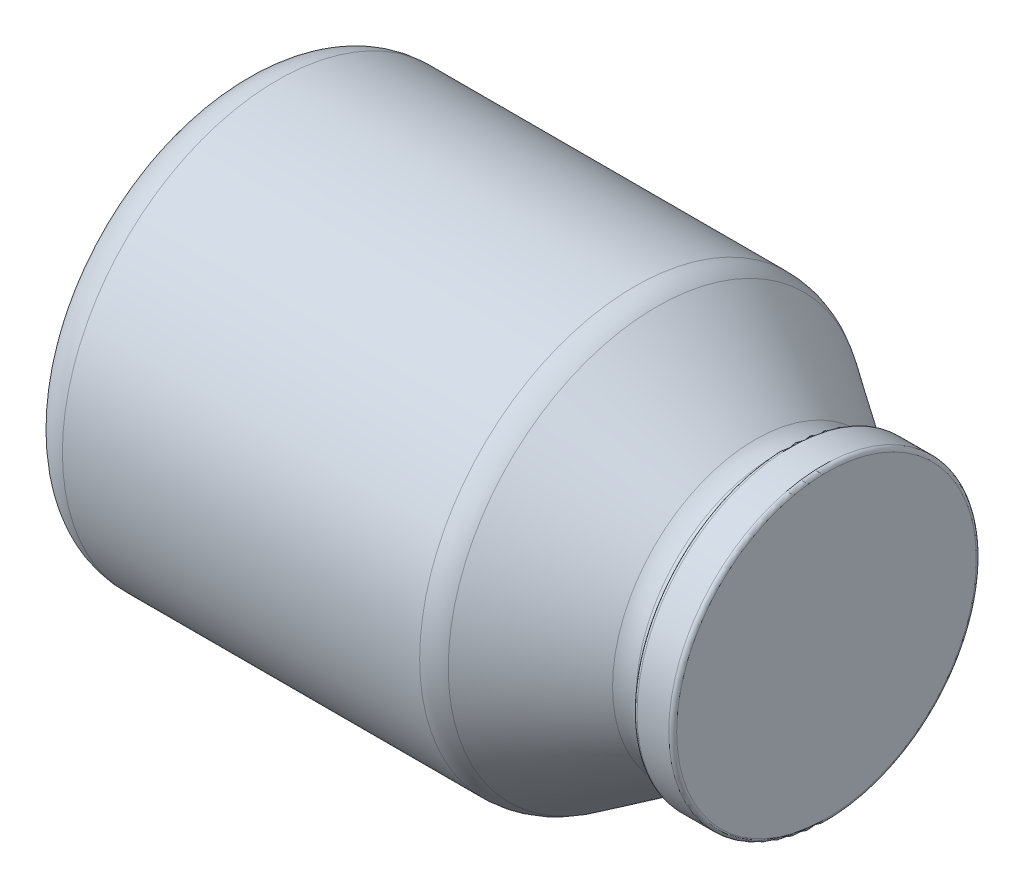
ISO-10303-21;
HEADER;
FILE_DESCRIPTION(('STEP AP214'),'2;1');
FILE_NAME('part.step','',(''),(''),'','','');
FILE_SCHEMA(('AUTOMOTIVE_DESIGN { 1 0 10303 214 1 1 1 1 }'));
ENDSEC;
DATA;
#1=APPLICATION_CONTEXT('core data for automotive mechanical design processes');
#2=APPLICATION_PROTOCOL_DEFINITION('international standard','automotive_design',2000,#1);
#3=PRODUCT_CONTEXT('',#1,'mechanical');
#4=PRODUCT('Part','Part','',(#3));
#5=PRODUCT_RELATED_PRODUCT_CATEGORY('part','',(#4));
#6=PRODUCT_DEFINITION_FORMATION('','',#4);
#7=PRODUCT_DEFINITION_CONTEXT('part definition',#1,'design');
#8=PRODUCT_DEFINITION('design','',#6,#7);
#9=PRODUCT_DEFINITION_SHAPE('','',#8);
#10=(LENGTH_UNIT() NAMED_UNIT(*) SI_UNIT(.MILLI.,.METRE.));
#11=(NAMED_UNIT(*) PLANE_ANGLE_UNIT() SI_UNIT($,.RADIAN.));
#12=(NAMED_UNIT(*) SI_UNIT($,.STERADIAN.) SOLID_ANGLE_UNIT());
#13=UNCERTAINTY_MEASURE_WITH_UNIT(LENGTH_MEASURE(1.E-05),#10,'distance_accuracy_value','');
#14=(GEOMETRIC_REPRESENTATION_CONTEXT(3) GLOBAL_UNCERTAINTY_ASSIGNED_CONTEXT((#13)) GLOBAL_UNIT_ASSIGNED_CONTEXT((#10,
#11,#12)) REPRESENTATION_CONTEXT('',''));
#15=CARTESIAN_POINT('',(0.,0.,0.));
#16=DIRECTION('',(0.,0.,1.));
#17=DIRECTION('',(1.,0.,0.));
#18=AXIS2_PLACEMENT_3D('',#15,#16,#17);
#19=CARTESIAN_POINT('',(0.,0.,0.));
#20=DIRECTION('',(1.,0.,0.));
#21=DIRECTION('',(0.,0.,-1.));
#22=AXIS2_PLACEMENT_3D('',#19,#20,#21);
#23=PLANE('',#22);
#24=CARTESIAN_POINT('',(0.,0.,0.));
#25=DIRECTION('',(-1.,0.,0.));
#26=DIRECTION('',(0.,0.,1.));
#27=AXIS2_PLACEMENT_3D('',#24,#25,#26);
#28=CIRCLE('',#27,53.);
#29=CARTESIAN_POINT('',(0.,0.,53.));
#30=VERTEX_POINT('',#29);
#31=EDGE_CURVE('E58',#30,#30,#28,.T.);
#32=ORIENTED_EDGE('',*,*,#31,.T.);
#33=EDGE_LOOP('',(#32));
#34=FACE_BOUND('',#33,.T.);
#35=ADVANCED_FACE('F38',(#34),#23,.F.);
#36=CARTESIAN_POINT('',(12.,0.,0.));
#37=DIRECTION('',(-1.,0.,0.));
#38=DIRECTION('',(0.,0.,1.));
#39=AXIS2_PLACEMENT_3D('',#36,#37,#38);
#40=TOROIDAL_SURFACE('',#39,53.,12.);
#41=ORIENTED_EDGE('',*,*,#31,.F.);
#42=EDGE_LOOP('',(#41));
#43=FACE_BOUND('',#42,.T.);
#44=CARTESIAN_POINT('',(12.,0.,0.));
#45=DIRECTION('',(-1.,0.,0.));
#46=DIRECTION('',(0.,0.,1.));
#47=AXIS2_PLACEMENT_3D('',#44,#45,#46);
#48=CIRCLE('',#47,65.);
#49=CARTESIAN_POINT('',(12.,0.,65.));
#50=VERTEX_POINT('',#49);
#51=EDGE_CURVE('E61',#50,#50,#48,.T.);
#52=ORIENTED_EDGE('',*,*,#51,.T.);
#53=EDGE_LOOP('',(#52));
#54=FACE_BOUND('',#53,.T.);
#55=ADVANCED_FACE('F97',(#43,#54),#40,.T.);
#56=CARTESIAN_POINT('',(0.,0.,0.));
#57=DIRECTION('',(-1.,0.,0.));
#58=DIRECTION('',(0.,0.,1.));
#59=AXIS2_PLACEMENT_3D('',#56,#57,#58);
#60=CYLINDRICAL_SURFACE('',#59,65.);
#61=ORIENTED_EDGE('',*,*,#51,.F.);
#62=EDGE_LOOP('',(#61));
#63=FACE_BOUND('',#62,.T.);
#64=CARTESIAN_POINT('',(120.,0.,0.));
#65=DIRECTION('',(-1.,0.,0.));
#66=DIRECTION('',(0.,0.,1.));
#67=AXIS2_PLACEMENT_3D('',#64,#65,#66);
#68=CIRCLE('',#67,65.);
#69=CARTESIAN_POINT('',(120.,0.,65.));
#70=VERTEX_POINT('',#69);
#71=EDGE_CURVE('E64',#70,#70,#68,.T.);
#72=ORIENTED_EDGE('',*,*,#71,.T.);
#73=EDGE_LOOP('',(#72));
#74=FACE_BOUND('',#73,.T.);
#75=ADVANCED_FACE('F103',(#63,#74),#60,.T.);
#76=CARTESIAN_POINT('',(120.,0.,0.));
#77=DIRECTION('',(-1.,0.,0.));
#78=DIRECTION('',(0.,0.,1.));
#79=AXIS2_PLACEMENT_3D('',#76,#77,#78);
#80=TOROIDAL_SURFACE('',#79,53.,12.);
#81=ORIENTED_EDGE('',*,*,#71,.F.);
#82=EDGE_LOOP('',(#81));
#83=FACE_BOUND('',#82,.T.);
#84=CARTESIAN_POINT('',(126.639752750023,0.,0.));
#85=DIRECTION('',(-1.,0.,0.));
#86=DIRECTION('',(0.,0.,1.));
#87=AXIS2_PLACEMENT_3D('',#84,#85,#86);
#88=CIRCLE('',#87,62.9956832392072);
#89=CARTESIAN_POINT('',(126.639752750023,0.,62.9956832392072));
#90=VERTEX_POINT('',#89);
#91=EDGE_CURVE('E67',#90,#90,#88,.T.);
#92=ORIENTED_EDGE('',*,*,#91,.T.);
#93=EDGE_LOOP('',(#92));
#94=FACE_BOUND('',#93,.T.);
#95=ADVANCED_FACE('F190',(#83,#94),#80,.T.);
#96=CARTESIAN_POINT('',(156.485534451082,0.,0.));
#97=DIRECTION('',(-1.,0.,0.));
#98=DIRECTION('',(0.,0.,1.));
#99=AXIS2_PLACEMENT_3D('',#96,#97,#98);
#100=CONICAL_SURFACE('',#99,43.1702639673274,0.586336000758835);
#101=ORIENTED_EDGE('',*,*,#91,.F.);
#102=EDGE_LOOP('',(#101));
#103=FACE_BOUND('',#102,.T.);
#104=CARTESIAN_POINT('',(156.485534451082,0.,0.));
#105=DIRECTION('',(-1.,0.,0.));
#106=DIRECTION('',(0.,0.,1.));
#107=AXIS2_PLACEMENT_3D('',#104,#105,#106);
#108=CIRCLE('',#107,43.1702639673274);
#109=CARTESIAN_POINT('',(156.485534451082,0.,43.1702639673274));
#110=VERTEX_POINT('',#109);
#111=EDGE_CURVE('E70',#110,#110,#108,.T.);
#112=ORIENTED_EDGE('',*,*,#111,.T.);
#113=EDGE_LOOP('',(#112));
#114=FACE_BOUND('',#113,.T.);
#115=ADVANCED_FACE('F178',(#103,#114),#100,.T.);
#116=CARTESIAN_POINT('',(162.018661742767,0.,0.));
#117=DIRECTION('',(-1.,0.,0.));
#118=DIRECTION('',(0.,0.,1.));
#119=AXIS2_PLACEMENT_3D('',#116,#117,#118);
#120=TOROIDAL_SURFACE('',#119,51.5,10.);
#121=ORIENTED_EDGE('',*,*,#111,.F.);
#122=EDGE_LOOP('',(#121));
#123=FACE_BOUND('',#122,.T.);
#124=CARTESIAN_POINT('',(162.018661742767,0.,0.));
#125=DIRECTION('',(-1.,0.,0.));
#126=DIRECTION('',(0.,0.,1.));
#127=AXIS2_PLACEMENT_3D('',#124,#125,#126);
#128=CIRCLE('',#127,41.5);
#129=CARTESIAN_POINT('',(162.018661742767,0.,41.5));
#130=VERTEX_POINT('',#129);
#131=EDGE_CURVE('E73',#130,#130,#128,.T.);
#132=ORIENTED_EDGE('',*,*,#131,.T.);
#133=EDGE_LOOP('',(#132));
#134=FACE_BOUND('',#133,.T.);
#135=ADVANCED_FACE('F93',(#123,#134),#120,.F.);
#136=CARTESIAN_POINT('',(0.,0.,0.));
#137=DIRECTION('',(-1.,0.,0.));
#138=DIRECTION('',(0.,0.,1.));
#139=AXIS2_PLACEMENT_3D('',#136,#137,#138);
#140=CYLINDRICAL_SURFACE('',#139,41.5);
#141=ORIENTED_EDGE('',*,*,#131,.F.);
#142=EDGE_LOOP('',(#141));
#143=FACE_BOUND('',#142,.T.);
#144=CARTESIAN_POINT('',(166.,0.,0.));
#145=DIRECTION('',(-1.,0.,0.));
#146=DIRECTION('',(0.,0.,1.));
#147=AXIS2_PLACEMENT_3D('',#144,#145,#146);
#148=CIRCLE('',#147,41.5);
#149=CARTESIAN_POINT('',(166.,0.,41.5));
#150=VERTEX_POINT('',#149);
#151=EDGE_CURVE('E76',#150,#150,#148,.T.);
#152=ORIENTED_EDGE('',*,*,#151,.T.);
#153=EDGE_LOOP('',(#152));
#154=FACE_BOUND('',#153,.T.);
#155=ADVANCED_FACE('F80',(#143,#154),#140,.T.);
#156=CARTESIAN_POINT('',(166.,41.5,0.));
#157=DIRECTION('',(1.,0.,0.));
#158=DIRECTION('',(0.,0.,-1.));
#159=AXIS2_PLACEMENT_3D('',#156,#157,#158);
#160=PLANE('',#159);
#161=CARTESIAN_POINT('',(166.,0.,0.));
#162=DIRECTION('',(1.,0.,0.));
#163=DIRECTION('',(0.,0.,-1.));
#164=AXIS2_PLACEMENT_3D('',#161,#162,#163);
#165=CIRCLE('',#164,45.3);
#166=CARTESIAN_POINT('',(166.,0.,-45.3));
#167=VERTEX_POINT('',#166);
#168=EDGE_CURVE('E10',#167,#167,#165,.F.);
#169=ORIENTED_EDGE('',*,*,#168,.T.);
#170=EDGE_LOOP('',(#169));
#171=FACE_BOUND('',#170,.T.);
#172=ORIENTED_EDGE('',*,*,#151,.F.);
#173=EDGE_LOOP('',(#172));
#174=FACE_BOUND('',#173,.T.);
#175=ADVANCED_FACE('F82',(#171,#174),#160,.F.);
#176=CARTESIAN_POINT('',(0.,0.,0.));
#177=DIRECTION('',(-1.,0.,0.));
#178=DIRECTION('',(0.,0.,1.));
#179=AXIS2_PLACEMENT_3D('',#176,#177,#178);
#180=CYLINDRICAL_SURFACE('',#179,46.5);
#181=CARTESIAN_POINT('',(176.8,0.,0.));
#182=DIRECTION('',(-1.,0.,0.));
#183=DIRECTION('',(0.,0.,1.));
#184=AXIS2_PLACEMENT_3D('',#181,#182,#183);
#185=CIRCLE('',#184,46.5);
#186=CARTESIAN_POINT('',(176.8,0.,46.5));
#187=VERTEX_POINT('',#186);
#188=EDGE_CURVE('E49',#187,#187,#185,.T.);
#189=ORIENTED_EDGE('',*,*,#188,.T.);
#190=EDGE_LOOP('',(#189));
#191=FACE_BOUND('',#190,.T.);
#192=CARTESIAN_POINT('',(167.2,0.,0.));
#193=DIRECTION('',(1.,0.,0.));
#194=DIRECTION('',(0.,0.,-1.));
#195=AXIS2_PLACEMENT_3D('',#192,#193,#194);
#196=CIRCLE('',#195,46.5);
#197=CARTESIAN_POINT('',(167.2,0.,-46.5));
#198=VERTEX_POINT('',#197);
#199=EDGE_CURVE('E53',#198,#198,#196,.T.);
#200=ORIENTED_EDGE('',*,*,#199,.T.);
#201=EDGE_LOOP('',(#200));
#202=FACE_BOUND('',#201,.T.);
#203=ADVANCED_FACE('F84',(#191,#202),#180,.T.);
#204=CARTESIAN_POINT('',(178.,46.5,0.));
#205=DIRECTION('',(-1.,0.,0.));
#206=DIRECTION('',(0.,0.,1.));
#207=AXIS2_PLACEMENT_3D('',#204,#205,#206);
#208=PLANE('',#207);
#209=CARTESIAN_POINT('',(178.,0.,0.));
#210=DIRECTION('',(-1.,0.,0.));
#211=DIRECTION('',(0.,0.,1.));
#212=AXIS2_PLACEMENT_3D('',#209,#210,#211);
#213=CIRCLE('',#212,45.3);
#214=CARTESIAN_POINT('',(178.,0.,45.3));
#215=VERTEX_POINT('',#214);
#216=EDGE_CURVE('E45',#215,#215,#213,.F.);
#217=ORIENTED_EDGE('',*,*,#216,.T.);
#218=EDGE_LOOP('',(#217));
#219=FACE_BOUND('',#218,.T.);
#220=ADVANCED_FACE('F90',(#219),#208,.F.);
#221=CARTESIAN_POINT('',(176.8,0.,0.));
#222=DIRECTION('',(-1.,0.,0.));
#223=DIRECTION('',(0.,0.,1.));
#224=AXIS2_PLACEMENT_3D('',#221,#222,#223);
#225=TOROIDAL_SURFACE('',#224,45.3,1.2);
#226=ORIENTED_EDGE('',*,*,#216,.F.);
#227=EDGE_LOOP('',(#226));
#228=FACE_BOUND('',#227,.T.);
#229=ORIENTED_EDGE('',*,*,#188,.F.);
#230=EDGE_LOOP('',(#229));
#231=FACE_BOUND('',#230,.T.);
#232=ADVANCED_FACE('F107',(#228,#231),#225,.T.);
#233=CARTESIAN_POINT('',(167.2,0.,0.));
#234=DIRECTION('',(1.,0.,0.));
#235=DIRECTION('',(0.,0.,-1.));
#236=AXIS2_PLACEMENT_3D('',#233,#234,#235);
#237=TOROIDAL_SURFACE('',#236,45.3,1.2);
#238=ORIENTED_EDGE('',*,*,#199,.F.);
#239=EDGE_LOOP('',(#238));
#240=FACE_BOUND('',#239,.T.);
#241=ORIENTED_EDGE('',*,*,#168,.F.);
#242=EDGE_LOOP('',(#241));
#243=FACE_BOUND('',#242,.T.);
#244=ADVANCED_FACE('F40',(#240,#243),#237,.T.);
#245=CLOSED_SHELL('',(#35,#55,#75,#95,#115,#135,#155,#175,#203,#220,#232,#244));
#246=MANIFOLD_SOLID_BREP('B2',#245);
#247=ADVANCED_BREP_SHAPE_REPRESENTATION('',(#18,#246),#14);
#248=SHAPE_DEFINITION_REPRESENTATION(#9,#247);
ENDSEC;
END-ISO-10303-21;
